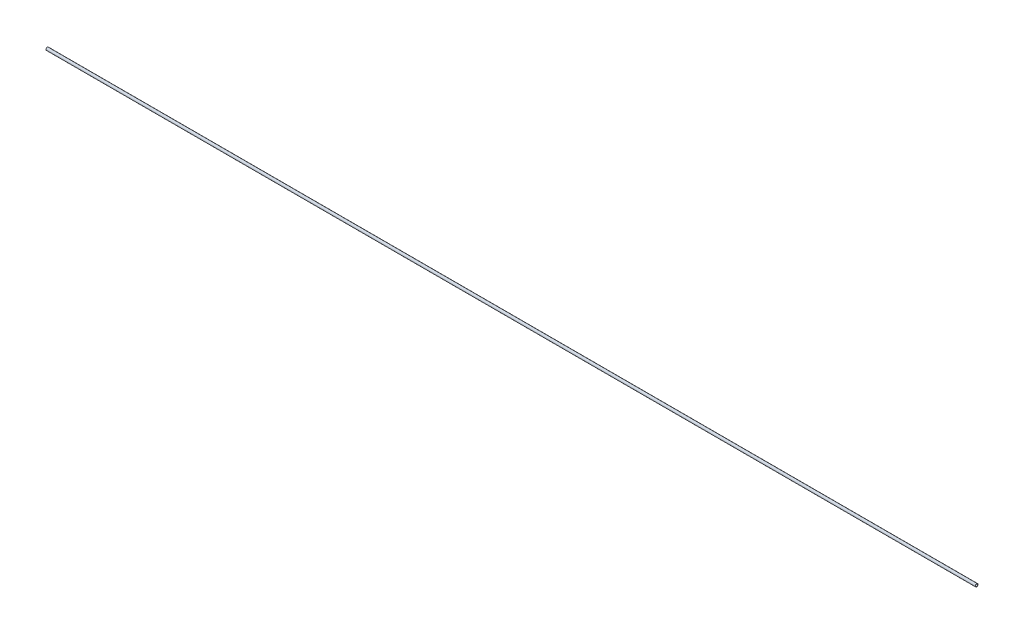
ISO-10303-21;
HEADER;
FILE_DESCRIPTION(('STEP AP214'),'2;1');
FILE_NAME('part.step','',(''),(''),'','','');
FILE_SCHEMA(('AUTOMOTIVE_DESIGN { 1 0 10303 214 1 1 1 1 }'));
ENDSEC;
DATA;
#1=APPLICATION_CONTEXT('core data for automotive mechanical design processes');
#2=APPLICATION_PROTOCOL_DEFINITION('international standard','automotive_design',2000,#1);
#3=PRODUCT_CONTEXT('',#1,'mechanical');
#4=PRODUCT('Part','Part','',(#3));
#5=PRODUCT_RELATED_PRODUCT_CATEGORY('part','',(#4));
#6=PRODUCT_DEFINITION_FORMATION('','',#4);
#7=PRODUCT_DEFINITION_CONTEXT('part definition',#1,'design');
#8=PRODUCT_DEFINITION('design','',#6,#7);
#9=PRODUCT_DEFINITION_SHAPE('','',#8);
#10=(LENGTH_UNIT() NAMED_UNIT(*) SI_UNIT(.MILLI.,.METRE.));
#11=(NAMED_UNIT(*) PLANE_ANGLE_UNIT() SI_UNIT($,.RADIAN.));
#12=(NAMED_UNIT(*) SI_UNIT($,.STERADIAN.) SOLID_ANGLE_UNIT());
#13=UNCERTAINTY_MEASURE_WITH_UNIT(LENGTH_MEASURE(1.E-05),#10,'distance_accuracy_value','');
#14=(GEOMETRIC_REPRESENTATION_CONTEXT(3) GLOBAL_UNCERTAINTY_ASSIGNED_CONTEXT((#13)) GLOBAL_UNIT_ASSIGNED_CONTEXT((#10,
#11,#12)) REPRESENTATION_CONTEXT('',''));
#15=CARTESIAN_POINT('',(0.,0.,0.));
#16=DIRECTION('',(0.,0.,1.));
#17=DIRECTION('',(1.,0.,0.));
#18=AXIS2_PLACEMENT_3D('',#15,#16,#17);
#19=CARTESIAN_POINT('',(8580.,0.,0.));
#20=DIRECTION('',(1.,0.,0.));
#21=DIRECTION('',(0.,0.,-1.));
#22=AXIS2_PLACEMENT_3D('',#19,#20,#21);
#23=PLANE('',#22);
#24=CARTESIAN_POINT('',(8580.,0.,0.));
#25=DIRECTION('',(1.,0.,0.));
#26=DIRECTION('',(0.,0.,-1.));
#27=AXIS2_PLACEMENT_3D('',#24,#25,#26);
#28=CIRCLE('',#27,12.7);
#29=CARTESIAN_POINT('',(8580.,0.,-12.7));
#30=VERTEX_POINT('',#29);
#31=EDGE_CURVE('E10',#30,#30,#28,.T.);
#32=ORIENTED_EDGE('',*,*,#31,.T.);
#33=EDGE_LOOP('',(#32));
#34=FACE_BOUND('',#33,.T.);
#35=CARTESIAN_POINT('',(8580.,0.,0.));
#36=DIRECTION('',(1.,0.,0.));
#37=DIRECTION('',(0.,0.,-1.));
#38=AXIS2_PLACEMENT_3D('',#35,#36,#37);
#39=CIRCLE('',#38,9.652);
#40=CARTESIAN_POINT('',(8580.,0.,-9.652));
#41=VERTEX_POINT('',#40);
#42=EDGE_CURVE('E45',#41,#41,#39,.T.);
#43=ORIENTED_EDGE('',*,*,#42,.F.);
#44=EDGE_LOOP('',(#43));
#45=FACE_BOUND('',#44,.T.);
#46=ADVANCED_FACE('F34',(#34,#45),#23,.T.);
#47=CARTESIAN_POINT('',(0.,0.,0.));
#48=DIRECTION('',(1.,0.,0.));
#49=DIRECTION('',(0.,0.,-1.));
#50=AXIS2_PLACEMENT_3D('',#47,#48,#49);
#51=PLANE('',#50);
#52=CARTESIAN_POINT('',(0.,0.,0.));
#53=DIRECTION('',(1.,0.,0.));
#54=DIRECTION('',(0.,0.,-1.));
#55=AXIS2_PLACEMENT_3D('',#52,#53,#54);
#56=CIRCLE('',#55,12.7);
#57=CARTESIAN_POINT('',(0.,0.,-12.7));
#58=VERTEX_POINT('',#57);
#59=EDGE_CURVE('E38',#58,#58,#56,.T.);
#60=ORIENTED_EDGE('',*,*,#59,.F.);
#61=EDGE_LOOP('',(#60));
#62=FACE_BOUND('',#61,.T.);
#63=CARTESIAN_POINT('',(0.,0.,0.));
#64=DIRECTION('',(1.,0.,0.));
#65=DIRECTION('',(0.,0.,-1.));
#66=AXIS2_PLACEMENT_3D('',#63,#64,#65);
#67=CIRCLE('',#66,9.652);
#68=CARTESIAN_POINT('',(0.,0.,-9.652));
#69=VERTEX_POINT('',#68);
#70=EDGE_CURVE('E47',#69,#69,#67,.T.);
#71=ORIENTED_EDGE('',*,*,#70,.T.);
#72=EDGE_LOOP('',(#71));
#73=FACE_BOUND('',#72,.T.);
#74=ADVANCED_FACE('F57',(#62,#73),#51,.F.);
#75=CARTESIAN_POINT('',(8580.,0.,0.));
#76=DIRECTION('',(-1.,0.,0.));
#77=DIRECTION('',(0.,0.,1.));
#78=AXIS2_PLACEMENT_3D('',#75,#76,#77);
#79=CYLINDRICAL_SURFACE('',#78,12.7);
#80=ORIENTED_EDGE('',*,*,#31,.F.);
#81=EDGE_LOOP('',(#80));
#82=FACE_BOUND('',#81,.T.);
#83=ORIENTED_EDGE('',*,*,#59,.T.);
#84=EDGE_LOOP('',(#83));
#85=FACE_BOUND('',#84,.T.);
#86=ADVANCED_FACE('F36',(#82,#85),#79,.T.);
#87=CARTESIAN_POINT('',(8580.,0.,0.));
#88=DIRECTION('',(-1.,0.,0.));
#89=DIRECTION('',(0.,0.,1.));
#90=AXIS2_PLACEMENT_3D('',#87,#88,#89);
#91=CYLINDRICAL_SURFACE('',#90,9.652);
#92=ORIENTED_EDGE('',*,*,#42,.T.);
#93=EDGE_LOOP('',(#92));
#94=FACE_BOUND('',#93,.T.);
#95=ORIENTED_EDGE('',*,*,#70,.F.);
#96=EDGE_LOOP('',(#95));
#97=FACE_BOUND('',#96,.T.);
#98=ADVANCED_FACE('F53',(#94,#97),#91,.F.);
#99=CLOSED_SHELL('',(#46,#74,#86,#98));
#100=MANIFOLD_SOLID_BREP('B2',#99);
#101=ADVANCED_BREP_SHAPE_REPRESENTATION('',(#18,#100),#14);
#102=SHAPE_DEFINITION_REPRESENTATION(#9,#101);
ENDSEC;
END-ISO-10303-21;
